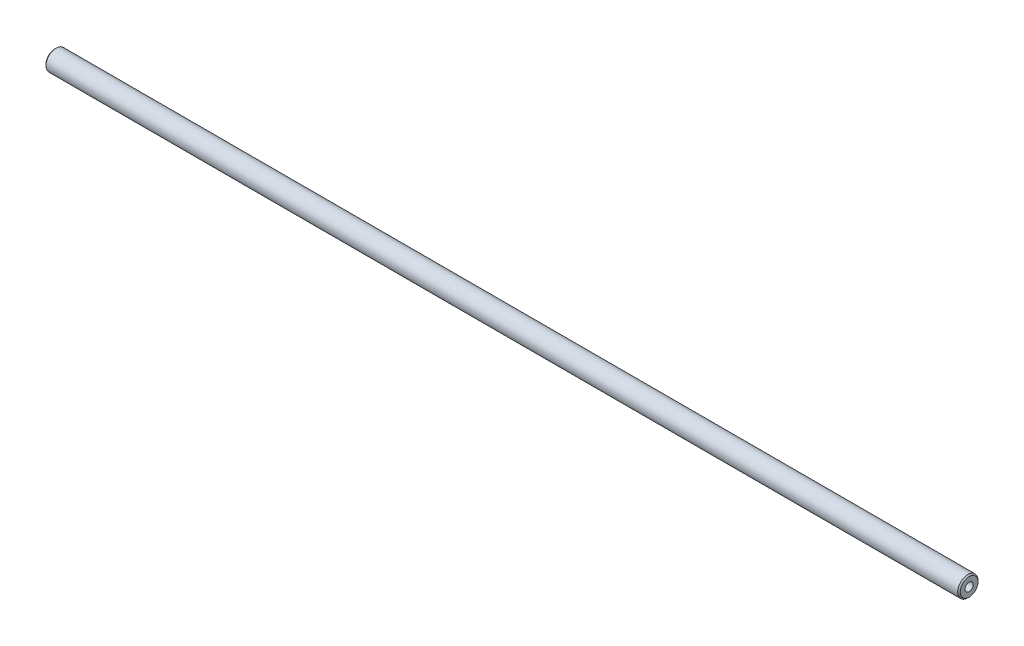
ISO-10303-21;
HEADER;
FILE_DESCRIPTION(('STEP AP214'),'2;1');
FILE_NAME('part.step','',(''),(''),'','','');
FILE_SCHEMA(('AUTOMOTIVE_DESIGN { 1 0 10303 214 1 1 1 1 }'));
ENDSEC;
DATA;
#1=APPLICATION_CONTEXT('core data for automotive mechanical design processes');
#2=APPLICATION_PROTOCOL_DEFINITION('international standard','automotive_design',2000,#1);
#3=PRODUCT_CONTEXT('',#1,'mechanical');
#4=PRODUCT('Part','Part','',(#3));
#5=PRODUCT_RELATED_PRODUCT_CATEGORY('part','',(#4));
#6=PRODUCT_DEFINITION_FORMATION('','',#4);
#7=PRODUCT_DEFINITION_CONTEXT('part definition',#1,'design');
#8=PRODUCT_DEFINITION('design','',#6,#7);
#9=PRODUCT_DEFINITION_SHAPE('','',#8);
#10=(LENGTH_UNIT() NAMED_UNIT(*) SI_UNIT(.MILLI.,.METRE.));
#11=(NAMED_UNIT(*) PLANE_ANGLE_UNIT() SI_UNIT($,.RADIAN.));
#12=(NAMED_UNIT(*) SI_UNIT($,.STERADIAN.) SOLID_ANGLE_UNIT());
#13=UNCERTAINTY_MEASURE_WITH_UNIT(LENGTH_MEASURE(1.E-05),#10,'distance_accuracy_value','');
#14=(GEOMETRIC_REPRESENTATION_CONTEXT(3) GLOBAL_UNCERTAINTY_ASSIGNED_CONTEXT((#13)) GLOBAL_UNIT_ASSIGNED_CONTEXT((#10,
#11,#12)) REPRESENTATION_CONTEXT('',''));
#15=CARTESIAN_POINT('',(0.,0.,0.));
#16=DIRECTION('',(0.,0.,1.));
#17=DIRECTION('',(1.,0.,0.));
#18=AXIS2_PLACEMENT_3D('',#15,#16,#17);
#19=CARTESIAN_POINT('',(180.,0.,0.));
#20=DIRECTION('',(-1.,0.,0.));
#21=DIRECTION('',(0.,0.,1.));
#22=AXIS2_PLACEMENT_3D('',#19,#20,#21);
#23=CYLINDRICAL_SURFACE('',#22,4.);
#24=CARTESIAN_POINT('',(-179.5,0.,0.));
#25=DIRECTION('',(1.,0.,0.));
#26=DIRECTION('',(0.,0.,-1.));
#27=AXIS2_PLACEMENT_3D('',#24,#25,#26);
#28=CIRCLE('',#27,4.);
#29=CARTESIAN_POINT('',(-179.5,0.,4.));
#30=VERTEX_POINT('',#29);
#31=EDGE_CURVE('E47',#30,#30,#28,.T.);
#32=CARTESIAN_POINT('',(179.5,0.,0.));
#33=DIRECTION('',(1.,0.,0.));
#34=DIRECTION('',(0.,0.,-1.));
#35=AXIS2_PLACEMENT_3D('',#32,#33,#34);
#36=CIRCLE('',#35,4.);
#37=CARTESIAN_POINT('',(179.5,0.,4.));
#38=VERTEX_POINT('',#37);
#39=EDGE_CURVE('E80',#38,#38,#36,.F.);
#40=CARTESIAN_POINT('',(-179.5,0.,4.));
#41=CARTESIAN_POINT('',(-175.760416666667,0.,4.));
#42=CARTESIAN_POINT('',(-172.020833333334,0.,4.));
#43=CARTESIAN_POINT('',(-164.541666666667,0.,4.));
#44=CARTESIAN_POINT('',(-160.802083333334,0.,4.));
#45=CARTESIAN_POINT('',(-153.322916666667,0.,4.));
#46=CARTESIAN_POINT('',(-149.583333333334,0.,4.));
#47=CARTESIAN_POINT('',(-142.104166666667,0.,4.));
#48=CARTESIAN_POINT('',(-138.364583333334,0.,4.));
#49=CARTESIAN_POINT('',(-130.885416666667,0.,4.));
#50=CARTESIAN_POINT('',(-127.145833333334,0.,4.));
#51=CARTESIAN_POINT('',(-119.666666666667,0.,4.));
#52=CARTESIAN_POINT('',(-115.927083333334,0.,4.));
#53=CARTESIAN_POINT('',(-108.447916666667,0.,4.));
#54=CARTESIAN_POINT('',(-104.708333333334,0.,4.));
#55=CARTESIAN_POINT('',(-97.2291666666669,0.,4.));
#56=CARTESIAN_POINT('',(-93.4895833333335,0.,4.));
#57=CARTESIAN_POINT('',(-86.0104166666669,0.,4.));
#58=CARTESIAN_POINT('',(-82.2708333333335,0.,4.));
#59=CARTESIAN_POINT('',(-74.7916666666669,0.,4.));
#60=CARTESIAN_POINT('',(-71.0520833333335,0.,4.));
#61=CARTESIAN_POINT('',(-63.5729166666669,0.,4.));
#62=CARTESIAN_POINT('',(-59.8333333333335,0.,4.));
#63=CARTESIAN_POINT('',(-52.3541666666669,0.,4.));
#64=CARTESIAN_POINT('',(-48.6145833333335,0.,4.));
#65=CARTESIAN_POINT('',(-41.1354166666669,0.,4.));
#66=CARTESIAN_POINT('',(-37.3958333333335,0.,4.));
#67=CARTESIAN_POINT('',(-29.9166666666669,0.,4.));
#68=CARTESIAN_POINT('',(-26.1770833333335,0.,4.));
#69=CARTESIAN_POINT('',(-18.6979166666669,0.,4.));
#70=CARTESIAN_POINT('',(-14.9583333333335,0.,4.));
#71=CARTESIAN_POINT('',(-7.47916666666686,0.,4.));
#72=CARTESIAN_POINT('',(-3.73958333333353,0.,4.));
#73=CARTESIAN_POINT('',(3.73958333333314,0.,4.));
#74=CARTESIAN_POINT('',(7.47916666666647,0.,4.));
#75=CARTESIAN_POINT('',(14.9583333333331,0.,4.));
#76=CARTESIAN_POINT('',(18.6979166666665,0.,4.));
#77=CARTESIAN_POINT('',(26.1770833333331,0.,4.));
#78=CARTESIAN_POINT('',(29.9166666666665,0.,4.));
#79=CARTESIAN_POINT('',(37.3958333333331,0.,4.));
#80=CARTESIAN_POINT('',(41.1354166666665,0.,4.));
#81=CARTESIAN_POINT('',(48.6145833333331,0.,4.));
#82=CARTESIAN_POINT('',(52.3541666666665,0.,4.));
#83=CARTESIAN_POINT('',(59.8333333333332,0.,4.));
#84=CARTESIAN_POINT('',(63.5729166666665,0.,4.));
#85=CARTESIAN_POINT('',(71.0520833333331,0.,4.));
#86=CARTESIAN_POINT('',(74.7916666666665,0.,4.));
#87=CARTESIAN_POINT('',(82.2708333333331,0.,4.));
#88=CARTESIAN_POINT('',(86.0104166666665,0.,4.));
#89=CARTESIAN_POINT('',(93.4895833333332,0.,4.));
#90=CARTESIAN_POINT('',(97.2291666666665,0.,4.));
#91=CARTESIAN_POINT('',(104.708333333333,0.,4.));
#92=CARTESIAN_POINT('',(108.447916666667,0.,4.));
#93=CARTESIAN_POINT('',(115.927083333333,0.,4.));
#94=CARTESIAN_POINT('',(119.666666666667,0.,4.));
#95=CARTESIAN_POINT('',(127.145833333333,0.,4.));
#96=CARTESIAN_POINT('',(130.885416666667,0.,4.));
#97=CARTESIAN_POINT('',(138.364583333333,0.,4.));
#98=CARTESIAN_POINT('',(142.104166666667,0.,4.));
#99=CARTESIAN_POINT('',(149.583333333333,0.,4.));
#100=CARTESIAN_POINT('',(153.322916666667,0.,4.));
#101=CARTESIAN_POINT('',(160.802083333333,0.,4.));
#102=CARTESIAN_POINT('',(164.541666666667,0.,4.));
#103=CARTESIAN_POINT('',(172.020833333333,0.,4.));
#104=CARTESIAN_POINT('',(175.760416666667,0.,4.));
#105=CARTESIAN_POINT('',(179.5,0.,4.));
#106=B_SPLINE_CURVE_WITH_KNOTS('',3,(#40,#41,#42,#43,#44,#45,#46,#47,#48,#49,#50,#51,#52,#53,
#54,#55,#56,#57,#58,#59,#60,#61,#62,#63,#64,#65,#66,#67,#68,#69,#70,#71,#72,#73,#74,#75,#76,#77,
#78,#79,#80,#81,#82,#83,#84,#85,#86,#87,#88,#89,#90,#91,#92,#93,#94,#95,#96,#97,#98,#99,#100,
#101,#102,#103,#104,#105),.UNSPECIFIED.,.F.,.F.,(4,2,2,2,2,2,2,2,2,2,2,2,2,2,2,2,2,2,2,2,2,2,2,
2,2,2,2,2,2,2,2,2,4),(0.,11.21875,22.4375,33.65625,44.875,56.09375,67.3125,78.5312500000001,
89.75,100.96875,112.1875,123.40625,134.625,145.84375,157.0625,168.28125,179.5,190.71875,
201.9375,213.15625,224.375,235.59375,246.8125,258.03125,269.25,280.46875,291.6875,302.90625,
314.125,325.34375,336.5625,347.78125,359.),.UNSPECIFIED.);
#107=EDGE_CURVE('BSEAM38',#30,#38,#106,.T.);
#108=ORIENTED_EDGE('',*,*,#31,.T.);
#109=ORIENTED_EDGE('',*,*,#39,.T.);
#110=ORIENTED_EDGE('',*,*,#107,.T.);
#111=ORIENTED_EDGE('',*,*,#107,.F.);
#112=EDGE_LOOP('',(#108,#110,#109,#111));
#113=FACE_BOUND('',#112,.T.);
#114=ADVANCED_FACE('F38',(#113),#23,.T.);
#115=CARTESIAN_POINT('',(180.,0.,0.));
#116=DIRECTION('',(1.,0.,0.));
#117=DIRECTION('',(0.,0.,-1.));
#118=AXIS2_PLACEMENT_3D('',#115,#116,#117);
#119=PLANE('',#118);
#120=CARTESIAN_POINT('',(180.,0.,0.));
#121=DIRECTION('',(1.,0.,0.));
#122=DIRECTION('',(0.,0.,-1.));
#123=AXIS2_PLACEMENT_3D('',#120,#121,#122);
#124=CIRCLE('',#123,3.49999999999989);
#125=CARTESIAN_POINT('',(180.,0.,-3.49999999999989));
#126=VERTEX_POINT('',#125);
#127=EDGE_CURVE('E11',#126,#126,#124,.T.);
#128=ORIENTED_EDGE('',*,*,#127,.T.);
#129=EDGE_LOOP('',(#128));
#130=FACE_BOUND('',#129,.T.);
#131=CARTESIAN_POINT('',(180.,0.,0.));
#132=DIRECTION('',(1.,0.,0.));
#133=DIRECTION('',(0.,0.,-1.));
#134=AXIS2_PLACEMENT_3D('',#131,#132,#133);
#135=CIRCLE('',#134,1.62099999999999);
#136=CARTESIAN_POINT('',(180.,0.,-1.62099999999999));
#137=VERTEX_POINT('',#136);
#138=EDGE_CURVE('E64',#137,#137,#135,.T.);
#139=ORIENTED_EDGE('',*,*,#138,.F.);
#140=EDGE_LOOP('',(#139));
#141=FACE_BOUND('',#140,.T.);
#142=ADVANCED_FACE('F97',(#130,#141),#119,.T.);
#143=CARTESIAN_POINT('',(-180.,0.,0.));
#144=DIRECTION('',(1.,0.,0.));
#145=DIRECTION('',(0.,0.,-1.));
#146=AXIS2_PLACEMENT_3D('',#143,#144,#145);
#147=PLANE('',#146);
#148=CARTESIAN_POINT('',(-180.,0.,0.));
#149=DIRECTION('',(1.,0.,0.));
#150=DIRECTION('',(0.,0.,-1.));
#151=AXIS2_PLACEMENT_3D('',#148,#149,#150);
#152=CIRCLE('',#151,3.50000000000006);
#153=CARTESIAN_POINT('',(-180.,0.,-3.50000000000006));
#154=VERTEX_POINT('',#153);
#155=EDGE_CURVE('E77',#154,#154,#152,.F.);
#156=ORIENTED_EDGE('',*,*,#155,.T.);
#157=EDGE_LOOP('',(#156));
#158=FACE_BOUND('',#157,.T.);
#159=CARTESIAN_POINT('',(-180.,0.,0.));
#160=DIRECTION('',(-1.,0.,0.));
#161=DIRECTION('',(0.,0.,1.));
#162=AXIS2_PLACEMENT_3D('',#159,#160,#161);
#163=CIRCLE('',#162,1.62099999999999);
#164=CARTESIAN_POINT('',(-180.,0.,1.62099999999999));
#165=VERTEX_POINT('',#164);
#166=EDGE_CURVE('E65',#165,#165,#163,.T.);
#167=ORIENTED_EDGE('',*,*,#166,.F.);
#168=EDGE_LOOP('',(#167));
#169=FACE_BOUND('',#168,.T.);
#170=ADVANCED_FACE('F93',(#158,#169),#147,.F.);
#171=CARTESIAN_POINT('',(165.,0.,0.));
#172=DIRECTION('',(1.,0.,0.));
#173=DIRECTION('',(0.,0.,-1.));
#174=AXIS2_PLACEMENT_3D('',#171,#172,#173);
#175=CONICAL_SURFACE('',#174,1.62099999999999,1.02974425887775);
#176=CARTESIAN_POINT('',(164.026004937,0.,0.));
#177=VERTEX_POINT('',#176);
#178=VERTEX_LOOP('',#177);
#179=FACE_BOUND('',#178,.T.);
#180=CARTESIAN_POINT('',(165.,0.,0.));
#181=DIRECTION('',(1.,0.,0.));
#182=DIRECTION('',(0.,0.,-1.));
#183=AXIS2_PLACEMENT_3D('',#180,#181,#182);
#184=CIRCLE('',#183,1.62099999999999);
#185=CARTESIAN_POINT('',(165.,0.,-1.62099999999999));
#186=VERTEX_POINT('',#185);
#187=EDGE_CURVE('E69',#186,#186,#184,.T.);
#188=ORIENTED_EDGE('',*,*,#187,.T.);
#189=EDGE_LOOP('',(#188));
#190=FACE_BOUND('',#189,.T.);
#191=ADVANCED_FACE('F96',(#179,#190),#175,.F.);
#192=CARTESIAN_POINT('',(180.,0.,0.));
#193=DIRECTION('',(1.,0.,0.));
#194=DIRECTION('',(0.,0.,-1.));
#195=AXIS2_PLACEMENT_3D('',#192,#193,#194);
#196=CYLINDRICAL_SURFACE('',#195,1.62099999999999);
#197=ORIENTED_EDGE('',*,*,#187,.F.);
#198=EDGE_LOOP('',(#197));
#199=FACE_BOUND('',#198,.T.);
#200=ORIENTED_EDGE('',*,*,#138,.T.);
#201=EDGE_LOOP('',(#200));
#202=FACE_BOUND('',#201,.T.);
#203=ADVANCED_FACE('F58',(#199,#202),#196,.F.);
#204=CARTESIAN_POINT('',(-165.,0.,0.));
#205=DIRECTION('',(-1.,0.,0.));
#206=DIRECTION('',(0.,0.,1.));
#207=AXIS2_PLACEMENT_3D('',#204,#205,#206);
#208=CONICAL_SURFACE('',#207,1.62099999999999,1.02974425887775);
#209=CARTESIAN_POINT('',(-164.026004937,0.,0.));
#210=VERTEX_POINT('',#209);
#211=VERTEX_LOOP('',#210);
#212=FACE_BOUND('',#211,.T.);
#213=CARTESIAN_POINT('',(-165.,0.,0.));
#214=DIRECTION('',(-1.,0.,0.));
#215=DIRECTION('',(0.,0.,1.));
#216=AXIS2_PLACEMENT_3D('',#213,#214,#215);
#217=CIRCLE('',#216,1.62099999999999);
#218=CARTESIAN_POINT('',(-165.,0.,1.62099999999999));
#219=VERTEX_POINT('',#218);
#220=EDGE_CURVE('E62',#219,#219,#217,.T.);
#221=ORIENTED_EDGE('',*,*,#220,.T.);
#222=EDGE_LOOP('',(#221));
#223=FACE_BOUND('',#222,.T.);
#224=ADVANCED_FACE('F54',(#212,#223),#208,.F.);
#225=CARTESIAN_POINT('',(-180.,0.,0.));
#226=DIRECTION('',(-1.,0.,0.));
#227=DIRECTION('',(0.,0.,1.));
#228=AXIS2_PLACEMENT_3D('',#225,#226,#227);
#229=CYLINDRICAL_SURFACE('',#228,1.62099999999999);
#230=ORIENTED_EDGE('',*,*,#220,.F.);
#231=EDGE_LOOP('',(#230));
#232=FACE_BOUND('',#231,.T.);
#233=ORIENTED_EDGE('',*,*,#166,.T.);
#234=EDGE_LOOP('',(#233));
#235=FACE_BOUND('',#234,.T.);
#236=ADVANCED_FACE('F57',(#232,#235),#229,.F.);
#237=CARTESIAN_POINT('',(-180.,0.,0.));
#238=DIRECTION('',(1.,0.,0.));
#239=DIRECTION('',(0.,0.,-1.));
#240=AXIS2_PLACEMENT_3D('',#237,#238,#239);
#241=CONICAL_SURFACE('',#240,3.50000000000006,0.785398163397557);
#242=ORIENTED_EDGE('',*,*,#31,.F.);
#243=EDGE_LOOP('',(#242));
#244=FACE_BOUND('',#243,.T.);
#245=ORIENTED_EDGE('',*,*,#155,.F.);
#246=EDGE_LOOP('',(#245));
#247=FACE_BOUND('',#246,.T.);
#248=ADVANCED_FACE('F88',(#244,#247),#241,.T.);
#249=CARTESIAN_POINT('',(179.5,0.,0.));
#250=DIRECTION('',(-1.,0.,0.));
#251=DIRECTION('',(0.,0.,1.));
#252=AXIS2_PLACEMENT_3D('',#249,#250,#251);
#253=CONICAL_SURFACE('',#252,4.,0.78539816339739);
#254=ORIENTED_EDGE('',*,*,#127,.F.);
#255=EDGE_LOOP('',(#254));
#256=FACE_BOUND('',#255,.T.);
#257=ORIENTED_EDGE('',*,*,#39,.F.);
#258=EDGE_LOOP('',(#257));
#259=FACE_BOUND('',#258,.T.);
#260=ADVANCED_FACE('F40',(#256,#259),#253,.T.);
#261=CLOSED_SHELL('',(#114,#142,#170,#191,#203,#224,#236,#248,#260));
#262=MANIFOLD_SOLID_BREP('B2',#261);
#263=ADVANCED_BREP_SHAPE_REPRESENTATION('',(#18,#262),#14);
#264=SHAPE_DEFINITION_REPRESENTATION(#9,#263);
ENDSEC;
END-ISO-10303-21;
